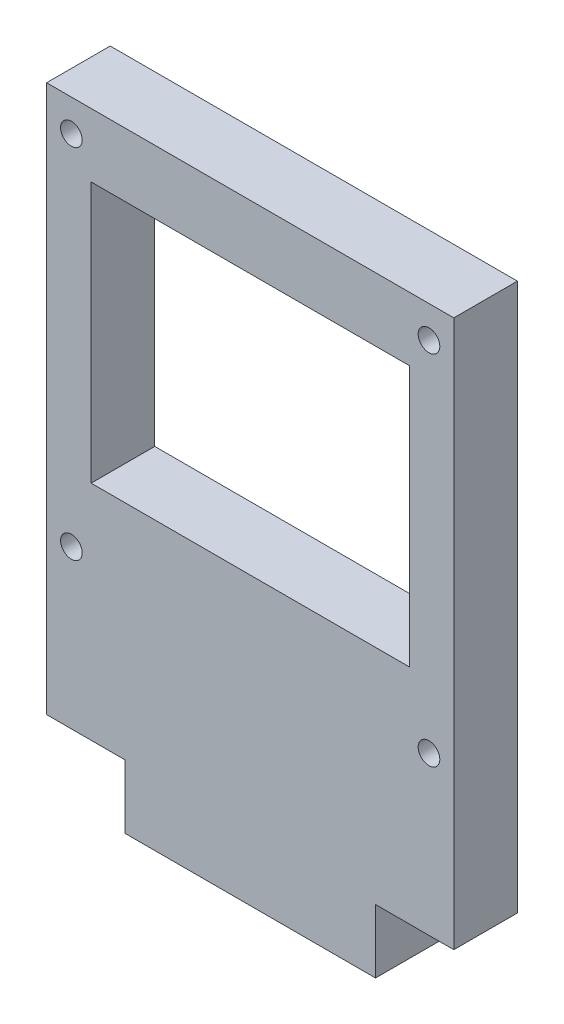
ISO-10303-21;
HEADER;
FILE_DESCRIPTION(('STEP AP214'),'2;1');
FILE_NAME('part.step','',(''),(''),'','','');
FILE_SCHEMA(('AUTOMOTIVE_DESIGN { 1 0 10303 214 1 1 1 1 }'));
ENDSEC;
DATA;
#1=APPLICATION_CONTEXT('core data for automotive mechanical design processes');
#2=APPLICATION_PROTOCOL_DEFINITION('international standard','automotive_design',2000,#1);
#3=PRODUCT_CONTEXT('',#1,'mechanical');
#4=PRODUCT('Part','Part','',(#3));
#5=PRODUCT_RELATED_PRODUCT_CATEGORY('part','',(#4));
#6=PRODUCT_DEFINITION_FORMATION('','',#4);
#7=PRODUCT_DEFINITION_CONTEXT('part definition',#1,'design');
#8=PRODUCT_DEFINITION('design','',#6,#7);
#9=PRODUCT_DEFINITION_SHAPE('','',#8);
#10=(LENGTH_UNIT() NAMED_UNIT(*) SI_UNIT(.MILLI.,.METRE.));
#11=(NAMED_UNIT(*) PLANE_ANGLE_UNIT() SI_UNIT($,.RADIAN.));
#12=(NAMED_UNIT(*) SI_UNIT($,.STERADIAN.) SOLID_ANGLE_UNIT());
#13=UNCERTAINTY_MEASURE_WITH_UNIT(LENGTH_MEASURE(1.E-05),#10,'distance_accuracy_value','');
#14=(GEOMETRIC_REPRESENTATION_CONTEXT(3) GLOBAL_UNCERTAINTY_ASSIGNED_CONTEXT((#13)) GLOBAL_UNIT_ASSIGNED_CONTEXT((#10,
#11,#12)) REPRESENTATION_CONTEXT('',''));
#15=CARTESIAN_POINT('',(0.,0.,0.));
#16=DIRECTION('',(0.,0.,1.));
#17=DIRECTION('',(1.,0.,0.));
#18=AXIS2_PLACEMENT_3D('',#15,#16,#17);
#19=CARTESIAN_POINT('',(-9.85,5.,-5.));
#20=DIRECTION('',(1.,0.,0.));
#21=DIRECTION('',(0.,0.,-1.));
#22=AXIS2_PLACEMENT_3D('',#19,#20,#21);
#23=PLANE('',#22);
#24=DIRECTION('',(0.,0.,1.));
#25=VECTOR('',#24,1.);
#26=CARTESIAN_POINT('',(-9.85,0.,-5.));
#27=LINE('',#26,#25);
#28=CARTESIAN_POINT('',(-9.85,0.,-5.));
#29=VERTEX_POINT('',#28);
#30=CARTESIAN_POINT('',(-9.85,0.,0.));
#31=VERTEX_POINT('',#30);
#32=EDGE_CURVE('E216',#29,#31,#27,.T.);
#33=ORIENTED_EDGE('',*,*,#32,.T.);
#34=DIRECTION('',(0.,-1.,0.));
#35=VECTOR('',#34,1.);
#36=CARTESIAN_POINT('',(-9.85,5.,0.));
#37=LINE('',#36,#35);
#38=CARTESIAN_POINT('',(-9.85,5.,0.));
#39=VERTEX_POINT('',#38);
#40=EDGE_CURVE('E11',#39,#31,#37,.T.);
#41=ORIENTED_EDGE('',*,*,#40,.F.);
#42=DIRECTION('',(0.,0.,1.));
#43=VECTOR('',#42,1.);
#44=CARTESIAN_POINT('',(-9.85,5.,-5.));
#45=LINE('',#44,#43);
#46=CARTESIAN_POINT('',(-9.85,5.,-5.));
#47=VERTEX_POINT('',#46);
#48=EDGE_CURVE('E209',#47,#39,#45,.T.);
#49=ORIENTED_EDGE('',*,*,#48,.F.);
#50=DIRECTION('',(0.,-1.,0.));
#51=VECTOR('',#50,1.);
#52=CARTESIAN_POINT('',(-9.85,5.,-5.));
#53=LINE('',#52,#51);
#54=EDGE_CURVE('E56',#47,#29,#53,.T.);
#55=ORIENTED_EDGE('',*,*,#54,.T.);
#56=EDGE_LOOP('',(#33,#41,#49,#55));
#57=FACE_BOUND('',#56,.T.);
#58=ADVANCED_FACE('F39',(#57),#23,.F.);
#59=CARTESIAN_POINT('',(-9.85,5.,0.));
#60=DIRECTION('',(0.,0.,-1.));
#61=DIRECTION('',(-1.,0.,0.));
#62=AXIS2_PLACEMENT_3D('',#59,#60,#61);
#63=PLANE('',#62);
#64=CARTESIAN_POINT('',(14.05,45.5,0.));
#65=DIRECTION('',(0.,0.,1.));
#66=DIRECTION('',(-1.,0.,0.));
#67=AXIS2_PLACEMENT_3D('',#64,#65,#66);
#68=CIRCLE('',#67,0.850000000000001);
#69=CARTESIAN_POINT('',(14.9,45.5,0.));
#70=VERTEX_POINT('',#69);
#71=EDGE_CURVE('E411',#70,#70,#68,.T.);
#72=ORIENTED_EDGE('',*,*,#71,.F.);
#73=EDGE_LOOP('',(#72));
#74=FACE_BOUND('',#73,.T.);
#75=CARTESIAN_POINT('',(14.05,17.4,0.));
#76=DIRECTION('',(0.,0.,1.));
#77=DIRECTION('',(-1.,0.,0.));
#78=AXIS2_PLACEMENT_3D('',#75,#76,#77);
#79=CIRCLE('',#78,0.85);
#80=CARTESIAN_POINT('',(14.9,17.4,0.));
#81=VERTEX_POINT('',#80);
#82=EDGE_CURVE('E415',#81,#81,#79,.T.);
#83=ORIENTED_EDGE('',*,*,#82,.F.);
#84=EDGE_LOOP('',(#83));
#85=FACE_BOUND('',#84,.T.);
#86=CARTESIAN_POINT('',(-14.05,17.4,0.));
#87=DIRECTION('',(0.,0.,1.));
#88=DIRECTION('',(1.,0.,0.));
#89=AXIS2_PLACEMENT_3D('',#86,#87,#88);
#90=CIRCLE('',#89,0.85);
#91=CARTESIAN_POINT('',(-13.2,17.4,0.));
#92=VERTEX_POINT('',#91);
#93=EDGE_CURVE('E421',#92,#92,#90,.T.);
#94=ORIENTED_EDGE('',*,*,#93,.F.);
#95=EDGE_LOOP('',(#94));
#96=FACE_BOUND('',#95,.T.);
#97=CARTESIAN_POINT('',(-14.05,45.5,0.));
#98=DIRECTION('',(0.,0.,1.));
#99=DIRECTION('',(1.,0.,0.));
#100=AXIS2_PLACEMENT_3D('',#97,#98,#99);
#101=CIRCLE('',#100,0.850000000000001);
#102=CARTESIAN_POINT('',(-13.2,45.5,0.));
#103=VERTEX_POINT('',#102);
#104=EDGE_CURVE('E269',#103,#103,#101,.T.);
#105=ORIENTED_EDGE('',*,*,#104,.F.);
#106=EDGE_LOOP('',(#105));
#107=FACE_BOUND('',#106,.T.);
#108=DIRECTION('',(1.,0.,0.));
#109=VECTOR('',#108,1.);
#110=CARTESIAN_POINT('',(-9.85,0.,0.));
#111=LINE('',#110,#109);
#112=CARTESIAN_POINT('',(9.85,0.,0.));
#113=VERTEX_POINT('',#112);
#114=EDGE_CURVE('E219',#31,#113,#111,.T.);
#115=ORIENTED_EDGE('',*,*,#114,.T.);
#116=DIRECTION('',(0.,-1.,0.));
#117=VECTOR('',#116,1.);
#118=CARTESIAN_POINT('',(9.85,5.,0.));
#119=LINE('',#118,#117);
#120=CARTESIAN_POINT('',(9.85,5.,0.));
#121=VERTEX_POINT('',#120);
#122=EDGE_CURVE('E48',#121,#113,#119,.T.);
#123=ORIENTED_EDGE('',*,*,#122,.F.);
#124=DIRECTION('',(1.,0.,0.));
#125=VECTOR('',#124,1.);
#126=CARTESIAN_POINT('',(-16.,5.,0.));
#127=LINE('',#126,#125);
#128=CARTESIAN_POINT('',(16.,5.,0.));
#129=VERTEX_POINT('',#128);
#130=EDGE_CURVE('E179',#121,#129,#127,.T.);
#131=ORIENTED_EDGE('',*,*,#130,.T.);
#132=DIRECTION('',(0.,1.,0.));
#133=VECTOR('',#132,1.);
#134=CARTESIAN_POINT('',(16.,5.,0.));
#135=LINE('',#134,#133);
#136=CARTESIAN_POINT('',(16.,48.,0.));
#137=VERTEX_POINT('',#136);
#138=EDGE_CURVE('E184',#129,#137,#135,.T.);
#139=ORIENTED_EDGE('',*,*,#138,.T.);
#140=DIRECTION('',(-1.,0.,0.));
#141=VECTOR('',#140,1.);
#142=CARTESIAN_POINT('',(-16.,48.,0.));
#143=LINE('',#142,#141);
#144=CARTESIAN_POINT('',(-16.,48.,0.));
#145=VERTEX_POINT('',#144);
#146=EDGE_CURVE('E188',#137,#145,#143,.T.);
#147=ORIENTED_EDGE('',*,*,#146,.T.);
#148=DIRECTION('',(0.,-1.,0.));
#149=VECTOR('',#148,1.);
#150=CARTESIAN_POINT('',(-16.,5.,0.));
#151=LINE('',#150,#149);
#152=CARTESIAN_POINT('',(-16.,5.,0.));
#153=VERTEX_POINT('',#152);
#154=EDGE_CURVE('E171',#145,#153,#151,.T.);
#155=ORIENTED_EDGE('',*,*,#154,.T.);
#156=EDGE_CURVE('E180',#153,#39,#127,.T.);
#157=ORIENTED_EDGE('',*,*,#156,.T.);
#158=ORIENTED_EDGE('',*,*,#40,.T.);
#159=EDGE_LOOP('',(#115,#123,#131,#139,#147,#155,#157,#158));
#160=FACE_BOUND('',#159,.T.);
#161=DIRECTION('',(1.,0.,0.));
#162=VECTOR('',#161,1.);
#163=CARTESIAN_POINT('',(-12.5,22.5,0.));
#164=LINE('',#163,#162);
#165=CARTESIAN_POINT('',(-12.5,22.5,0.));
#166=VERTEX_POINT('',#165);
#167=CARTESIAN_POINT('',(12.5,22.5,0.));
#168=VERTEX_POINT('',#167);
#169=EDGE_CURVE('E150',#166,#168,#164,.T.);
#170=ORIENTED_EDGE('',*,*,#169,.F.);
#171=DIRECTION('',(0.,-1.,0.));
#172=VECTOR('',#171,1.);
#173=CARTESIAN_POINT('',(-12.5,22.5,0.));
#174=LINE('',#173,#172);
#175=CARTESIAN_POINT('',(-12.5,43.,0.));
#176=VERTEX_POINT('',#175);
#177=EDGE_CURVE('E157',#176,#166,#174,.T.);
#178=ORIENTED_EDGE('',*,*,#177,.F.);
#179=DIRECTION('',(-1.,0.,0.));
#180=VECTOR('',#179,1.);
#181=CARTESIAN_POINT('',(-12.5,43.,0.));
#182=LINE('',#181,#180);
#183=CARTESIAN_POINT('',(12.5,43.,0.));
#184=VERTEX_POINT('',#183);
#185=EDGE_CURVE('E161',#184,#176,#182,.T.);
#186=ORIENTED_EDGE('',*,*,#185,.F.);
#187=DIRECTION('',(0.,1.,0.));
#188=VECTOR('',#187,1.);
#189=CARTESIAN_POINT('',(12.5,22.5,0.));
#190=LINE('',#189,#188);
#191=EDGE_CURVE('E140',#168,#184,#190,.T.);
#192=ORIENTED_EDGE('',*,*,#191,.F.);
#193=EDGE_LOOP('',(#170,#178,#186,#192));
#194=FACE_BOUND('',#193,.T.);
#195=ADVANCED_FACE('F159',(#74,#85,#96,#107,#160,#194),#63,.F.);
#196=CARTESIAN_POINT('',(9.85,5.,-5.));
#197=DIRECTION('',(-1.,0.,0.));
#198=DIRECTION('',(0.,0.,1.));
#199=AXIS2_PLACEMENT_3D('',#196,#197,#198);
#200=PLANE('',#199);
#201=DIRECTION('',(0.,0.,-1.));
#202=VECTOR('',#201,1.);
#203=CARTESIAN_POINT('',(9.85,0.,-5.));
#204=LINE('',#203,#202);
#205=CARTESIAN_POINT('',(9.85,0.,-5.));
#206=VERTEX_POINT('',#205);
#207=EDGE_CURVE('E75',#113,#206,#204,.T.);
#208=ORIENTED_EDGE('',*,*,#207,.T.);
#209=DIRECTION('',(0.,-1.,0.));
#210=VECTOR('',#209,1.);
#211=CARTESIAN_POINT('',(9.85,5.,-5.));
#212=LINE('',#211,#210);
#213=CARTESIAN_POINT('',(9.85,5.,-5.));
#214=VERTEX_POINT('',#213);
#215=EDGE_CURVE('E229',#214,#206,#212,.T.);
#216=ORIENTED_EDGE('',*,*,#215,.F.);
#217=DIRECTION('',(0.,0.,-1.));
#218=VECTOR('',#217,1.);
#219=CARTESIAN_POINT('',(9.85,5.,-5.));
#220=LINE('',#219,#218);
#221=EDGE_CURVE('E212',#121,#214,#220,.T.);
#222=ORIENTED_EDGE('',*,*,#221,.F.);
#223=ORIENTED_EDGE('',*,*,#122,.T.);
#224=EDGE_LOOP('',(#208,#216,#222,#223));
#225=FACE_BOUND('',#224,.T.);
#226=ADVANCED_FACE('F233',(#225),#200,.F.);
#227=CARTESIAN_POINT('',(-9.85,5.,-5.));
#228=DIRECTION('',(0.,0.,1.));
#229=DIRECTION('',(1.,0.,0.));
#230=AXIS2_PLACEMENT_3D('',#227,#228,#229);
#231=PLANE('',#230);
#232=CARTESIAN_POINT('',(14.05,45.5,-5.));
#233=DIRECTION('',(0.,0.,1.));
#234=DIRECTION('',(1.,0.,0.));
#235=AXIS2_PLACEMENT_3D('',#232,#233,#234);
#236=CIRCLE('',#235,0.850000000000001);
#237=CARTESIAN_POINT('',(14.9,45.5,-5.));
#238=VERTEX_POINT('',#237);
#239=EDGE_CURVE('E409',#238,#238,#236,.F.);
#240=ORIENTED_EDGE('',*,*,#239,.F.);
#241=EDGE_LOOP('',(#240));
#242=FACE_BOUND('',#241,.T.);
#243=CARTESIAN_POINT('',(14.05,17.4,-5.));
#244=DIRECTION('',(0.,0.,1.));
#245=DIRECTION('',(1.,0.,0.));
#246=AXIS2_PLACEMENT_3D('',#243,#244,#245);
#247=CIRCLE('',#246,0.85);
#248=CARTESIAN_POINT('',(14.9,17.4,-5.));
#249=VERTEX_POINT('',#248);
#250=EDGE_CURVE('E417',#249,#249,#247,.F.);
#251=ORIENTED_EDGE('',*,*,#250,.F.);
#252=EDGE_LOOP('',(#251));
#253=FACE_BOUND('',#252,.T.);
#254=CARTESIAN_POINT('',(-14.05,17.4,-5.));
#255=DIRECTION('',(0.,0.,1.));
#256=DIRECTION('',(1.,0.,0.));
#257=AXIS2_PLACEMENT_3D('',#254,#255,#256);
#258=CIRCLE('',#257,0.85);
#259=CARTESIAN_POINT('',(-13.2,17.4,-5.));
#260=VERTEX_POINT('',#259);
#261=EDGE_CURVE('E275',#260,#260,#258,.F.);
#262=ORIENTED_EDGE('',*,*,#261,.F.);
#263=EDGE_LOOP('',(#262));
#264=FACE_BOUND('',#263,.T.);
#265=CARTESIAN_POINT('',(-14.05,45.5,-5.));
#266=DIRECTION('',(0.,0.,1.));
#267=DIRECTION('',(1.,0.,0.));
#268=AXIS2_PLACEMENT_3D('',#265,#266,#267);
#269=CIRCLE('',#268,0.850000000000001);
#270=CARTESIAN_POINT('',(-13.2,45.5,-5.));
#271=VERTEX_POINT('',#270);
#272=EDGE_CURVE('E265',#271,#271,#269,.F.);
#273=ORIENTED_EDGE('',*,*,#272,.F.);
#274=EDGE_LOOP('',(#273));
#275=FACE_BOUND('',#274,.T.);
#276=DIRECTION('',(-1.,0.,0.));
#277=VECTOR('',#276,1.);
#278=CARTESIAN_POINT('',(-9.85,0.,-5.));
#279=LINE('',#278,#277);
#280=EDGE_CURVE('E78',#206,#29,#279,.T.);
#281=ORIENTED_EDGE('',*,*,#280,.T.);
#282=ORIENTED_EDGE('',*,*,#54,.F.);
#283=DIRECTION('',(-1.,0.,0.));
#284=VECTOR('',#283,1.);
#285=CARTESIAN_POINT('',(-16.,5.,-5.));
#286=LINE('',#285,#284);
#287=CARTESIAN_POINT('',(-16.,5.,-5.));
#288=VERTEX_POINT('',#287);
#289=EDGE_CURVE('E243',#47,#288,#286,.T.);
#290=ORIENTED_EDGE('',*,*,#289,.T.);
#291=DIRECTION('',(0.,1.,0.));
#292=VECTOR('',#291,1.);
#293=CARTESIAN_POINT('',(-16.,5.,-5.));
#294=LINE('',#293,#292);
#295=CARTESIAN_POINT('',(-16.,48.,-5.));
#296=VERTEX_POINT('',#295);
#297=EDGE_CURVE('E262',#288,#296,#294,.T.);
#298=ORIENTED_EDGE('',*,*,#297,.T.);
#299=DIRECTION('',(1.,0.,0.));
#300=VECTOR('',#299,1.);
#301=CARTESIAN_POINT('',(-16.,48.,-5.));
#302=LINE('',#301,#300);
#303=CARTESIAN_POINT('',(16.,48.,-5.));
#304=VERTEX_POINT('',#303);
#305=EDGE_CURVE('E259',#296,#304,#302,.T.);
#306=ORIENTED_EDGE('',*,*,#305,.T.);
#307=DIRECTION('',(0.,-1.,0.));
#308=VECTOR('',#307,1.);
#309=CARTESIAN_POINT('',(16.,5.,-5.));
#310=LINE('',#309,#308);
#311=CARTESIAN_POINT('',(16.,5.,-5.00000000000001));
#312=VERTEX_POINT('',#311);
#313=EDGE_CURVE('E208',#304,#312,#310,.T.);
#314=ORIENTED_EDGE('',*,*,#313,.T.);
#315=EDGE_CURVE('E220',#312,#214,#286,.T.);
#316=ORIENTED_EDGE('',*,*,#315,.T.);
#317=ORIENTED_EDGE('',*,*,#215,.T.);
#318=EDGE_LOOP('',(#281,#282,#290,#298,#306,#314,#316,#317));
#319=FACE_BOUND('',#318,.T.);
#320=DIRECTION('',(-1.,0.,0.));
#321=VECTOR('',#320,1.);
#322=CARTESIAN_POINT('',(-12.5,22.5,-5.));
#323=LINE('',#322,#321);
#324=CARTESIAN_POINT('',(12.5,22.5,-5.));
#325=VERTEX_POINT('',#324);
#326=CARTESIAN_POINT('',(-12.5,22.5,-5.00000000000001));
#327=VERTEX_POINT('',#326);
#328=EDGE_CURVE('E196',#325,#327,#323,.T.);
#329=ORIENTED_EDGE('',*,*,#328,.F.);
#330=DIRECTION('',(0.,-1.,0.));
#331=VECTOR('',#330,1.);
#332=CARTESIAN_POINT('',(12.5,22.5,-5.));
#333=LINE('',#332,#331);
#334=CARTESIAN_POINT('',(12.5,43.,-5.));
#335=VERTEX_POINT('',#334);
#336=EDGE_CURVE('E142',#335,#325,#333,.T.);
#337=ORIENTED_EDGE('',*,*,#336,.F.);
#338=DIRECTION('',(1.,0.,0.));
#339=VECTOR('',#338,1.);
#340=CARTESIAN_POINT('',(-12.5,43.,-5.));
#341=LINE('',#340,#339);
#342=CARTESIAN_POINT('',(-12.5,43.,-5.));
#343=VERTEX_POINT('',#342);
#344=EDGE_CURVE('E251',#343,#335,#341,.T.);
#345=ORIENTED_EDGE('',*,*,#344,.F.);
#346=DIRECTION('',(0.,1.,0.));
#347=VECTOR('',#346,1.);
#348=CARTESIAN_POINT('',(-12.5,22.5,-5.));
#349=LINE('',#348,#347);
#350=EDGE_CURVE('E255',#327,#343,#349,.T.);
#351=ORIENTED_EDGE('',*,*,#350,.F.);
#352=EDGE_LOOP('',(#329,#337,#345,#351));
#353=FACE_BOUND('',#352,.T.);
#354=ADVANCED_FACE('F286',(#242,#253,#264,#275,#319,#353),#231,.F.);
#355=CARTESIAN_POINT('',(0.,0.,0.));
#356=DIRECTION('',(0.,1.,0.));
#357=DIRECTION('',(0.,0.,1.));
#358=AXIS2_PLACEMENT_3D('',#355,#356,#357);
#359=PLANE('',#358);
#360=ORIENTED_EDGE('',*,*,#32,.F.);
#361=ORIENTED_EDGE('',*,*,#280,.F.);
#362=ORIENTED_EDGE('',*,*,#207,.F.);
#363=ORIENTED_EDGE('',*,*,#114,.F.);
#364=EDGE_LOOP('',(#360,#361,#362,#363));
#365=FACE_BOUND('',#364,.T.);
#366=ADVANCED_FACE('F238',(#365),#359,.F.);
#367=CARTESIAN_POINT('',(-16.,5.,-58.6003731330296));
#368=DIRECTION('',(0.,-1.,0.));
#369=DIRECTION('',(0.,0.,-1.));
#370=AXIS2_PLACEMENT_3D('',#367,#368,#369);
#371=PLANE('',#370);
#372=ORIENTED_EDGE('',*,*,#289,.F.);
#373=ORIENTED_EDGE('',*,*,#48,.T.);
#374=ORIENTED_EDGE('',*,*,#156,.F.);
#375=DIRECTION('',(0.,0.,1.));
#376=VECTOR('',#375,1.);
#377=CARTESIAN_POINT('',(-16.,5.,-58.6003731330296));
#378=LINE('',#377,#376);
#379=EDGE_CURVE('E192',#288,#153,#378,.T.);
#380=ORIENTED_EDGE('',*,*,#379,.F.);
#381=EDGE_LOOP('',(#372,#373,#374,#380));
#382=FACE_BOUND('',#381,.T.);
#383=ADVANCED_FACE('F244',(#382),#371,.T.);
#384=ORIENTED_EDGE('',*,*,#130,.F.);
#385=ORIENTED_EDGE('',*,*,#221,.T.);
#386=ORIENTED_EDGE('',*,*,#315,.F.);
#387=DIRECTION('',(0.,0.,1.));
#388=VECTOR('',#387,1.);
#389=CARTESIAN_POINT('',(16.,5.,-58.6003731330296));
#390=LINE('',#389,#388);
#391=EDGE_CURVE('E200',#312,#129,#390,.T.);
#392=ORIENTED_EDGE('',*,*,#391,.T.);
#393=EDGE_LOOP('',(#384,#385,#386,#392));
#394=FACE_BOUND('',#393,.T.);
#395=ADVANCED_FACE('F320',(#394),#371,.T.);
#396=CARTESIAN_POINT('',(16.,5.,-58.6003731330296));
#397=DIRECTION('',(1.,0.,0.));
#398=DIRECTION('',(0.,0.,-1.));
#399=AXIS2_PLACEMENT_3D('',#396,#397,#398);
#400=PLANE('',#399);
#401=ORIENTED_EDGE('',*,*,#313,.F.);
#402=DIRECTION('',(0.,0.,1.));
#403=VECTOR('',#402,1.);
#404=CARTESIAN_POINT('',(16.,48.,-58.6003731330296));
#405=LINE('',#404,#403);
#406=EDGE_CURVE('E197',#304,#137,#405,.T.);
#407=ORIENTED_EDGE('',*,*,#406,.T.);
#408=ORIENTED_EDGE('',*,*,#138,.F.);
#409=ORIENTED_EDGE('',*,*,#391,.F.);
#410=EDGE_LOOP('',(#401,#407,#408,#409));
#411=FACE_BOUND('',#410,.T.);
#412=ADVANCED_FACE('F323',(#411),#400,.T.);
#413=CARTESIAN_POINT('',(-16.,48.,-58.6003731330296));
#414=DIRECTION('',(0.,1.,0.));
#415=DIRECTION('',(0.,0.,1.));
#416=AXIS2_PLACEMENT_3D('',#413,#414,#415);
#417=PLANE('',#416);
#418=ORIENTED_EDGE('',*,*,#305,.F.);
#419=DIRECTION('',(0.,0.,1.));
#420=VECTOR('',#419,1.);
#421=CARTESIAN_POINT('',(-16.,48.,-58.6003731330296));
#422=LINE('',#421,#420);
#423=EDGE_CURVE('E193',#296,#145,#422,.T.);
#424=ORIENTED_EDGE('',*,*,#423,.T.);
#425=ORIENTED_EDGE('',*,*,#146,.F.);
#426=ORIENTED_EDGE('',*,*,#406,.F.);
#427=EDGE_LOOP('',(#418,#424,#425,#426));
#428=FACE_BOUND('',#427,.T.);
#429=ADVANCED_FACE('F318',(#428),#417,.T.);
#430=CARTESIAN_POINT('',(-16.,5.,-58.6003731330296));
#431=DIRECTION('',(-1.,0.,0.));
#432=DIRECTION('',(0.,0.,1.));
#433=AXIS2_PLACEMENT_3D('',#430,#431,#432);
#434=PLANE('',#433);
#435=ORIENTED_EDGE('',*,*,#297,.F.);
#436=ORIENTED_EDGE('',*,*,#379,.T.);
#437=ORIENTED_EDGE('',*,*,#154,.F.);
#438=ORIENTED_EDGE('',*,*,#423,.F.);
#439=EDGE_LOOP('',(#435,#436,#437,#438));
#440=FACE_BOUND('',#439,.T.);
#441=ADVANCED_FACE('F315',(#440),#434,.T.);
#442=CARTESIAN_POINT('',(-12.5,22.5,-58.6003731330296));
#443=DIRECTION('',(0.,-1.,0.));
#444=DIRECTION('',(0.,0.,-1.));
#445=AXIS2_PLACEMENT_3D('',#442,#443,#444);
#446=PLANE('',#445);
#447=DIRECTION('',(0.,0.,1.));
#448=VECTOR('',#447,1.);
#449=CARTESIAN_POINT('',(12.5,22.5,-58.6003731330296));
#450=LINE('',#449,#448);
#451=EDGE_CURVE('E135',#325,#168,#450,.T.);
#452=ORIENTED_EDGE('',*,*,#451,.F.);
#453=ORIENTED_EDGE('',*,*,#328,.T.);
#454=DIRECTION('',(0.,0.,1.));
#455=VECTOR('',#454,1.);
#456=CARTESIAN_POINT('',(-12.5,22.5,-58.6003731330296));
#457=LINE('',#456,#455);
#458=EDGE_CURVE('E147',#327,#166,#457,.T.);
#459=ORIENTED_EDGE('',*,*,#458,.T.);
#460=ORIENTED_EDGE('',*,*,#169,.T.);
#461=EDGE_LOOP('',(#452,#453,#459,#460));
#462=FACE_BOUND('',#461,.T.);
#463=ADVANCED_FACE('F151',(#462),#446,.F.);
#464=CARTESIAN_POINT('',(12.5,22.5,-58.6003731330296));
#465=DIRECTION('',(1.,0.,0.));
#466=DIRECTION('',(0.,0.,-1.));
#467=AXIS2_PLACEMENT_3D('',#464,#465,#466);
#468=PLANE('',#467);
#469=DIRECTION('',(0.,0.,1.));
#470=VECTOR('',#469,1.);
#471=CARTESIAN_POINT('',(12.5,43.,-58.6003731330296));
#472=LINE('',#471,#470);
#473=EDGE_CURVE('E146',#335,#184,#472,.T.);
#474=ORIENTED_EDGE('',*,*,#473,.F.);
#475=ORIENTED_EDGE('',*,*,#336,.T.);
#476=ORIENTED_EDGE('',*,*,#451,.T.);
#477=ORIENTED_EDGE('',*,*,#191,.T.);
#478=EDGE_LOOP('',(#474,#475,#476,#477));
#479=FACE_BOUND('',#478,.T.);
#480=ADVANCED_FACE('F138',(#479),#468,.F.);
#481=CARTESIAN_POINT('',(-12.5,43.,-58.6003731330296));
#482=DIRECTION('',(0.,1.,0.));
#483=DIRECTION('',(0.,0.,1.));
#484=AXIS2_PLACEMENT_3D('',#481,#482,#483);
#485=PLANE('',#484);
#486=DIRECTION('',(0.,0.,1.));
#487=VECTOR('',#486,1.);
#488=CARTESIAN_POINT('',(-12.5,43.,-58.6003731330296));
#489=LINE('',#488,#487);
#490=EDGE_CURVE('E168',#343,#176,#489,.T.);
#491=ORIENTED_EDGE('',*,*,#490,.F.);
#492=ORIENTED_EDGE('',*,*,#344,.T.);
#493=ORIENTED_EDGE('',*,*,#473,.T.);
#494=ORIENTED_EDGE('',*,*,#185,.T.);
#495=EDGE_LOOP('',(#491,#492,#493,#494));
#496=FACE_BOUND('',#495,.T.);
#497=ADVANCED_FACE('F287',(#496),#485,.F.);
#498=CARTESIAN_POINT('',(-12.5,22.5,-58.6003731330296));
#499=DIRECTION('',(-1.,0.,0.));
#500=DIRECTION('',(0.,0.,1.));
#501=AXIS2_PLACEMENT_3D('',#498,#499,#500);
#502=PLANE('',#501);
#503=ORIENTED_EDGE('',*,*,#458,.F.);
#504=ORIENTED_EDGE('',*,*,#350,.T.);
#505=ORIENTED_EDGE('',*,*,#490,.T.);
#506=ORIENTED_EDGE('',*,*,#177,.T.);
#507=EDGE_LOOP('',(#503,#504,#505,#506));
#508=FACE_BOUND('',#507,.T.);
#509=ADVANCED_FACE('F284',(#508),#502,.F.);
#510=CARTESIAN_POINT('',(-14.05,45.5,-7.40416305603427));
#511=DIRECTION('',(0.,0.,1.));
#512=DIRECTION('',(1.,0.,0.));
#513=AXIS2_PLACEMENT_3D('',#510,#511,#512);
#514=CYLINDRICAL_SURFACE('',#513,0.850000000000001);
#515=CARTESIAN_POINT('',(-13.2,45.5,-5.));
#516=CARTESIAN_POINT('',(-13.2,45.5,-4.94791666666667));
#517=CARTESIAN_POINT('',(-13.2,45.5,-4.89583333333333));
#518=CARTESIAN_POINT('',(-13.2,45.5,-4.79166666666667));
#519=CARTESIAN_POINT('',(-13.2,45.5,-4.73958333333333));
#520=CARTESIAN_POINT('',(-13.2,45.5,-4.63541666666667));
#521=CARTESIAN_POINT('',(-13.2,45.5,-4.58333333333333));
#522=CARTESIAN_POINT('',(-13.2,45.5,-4.47916666666667));
#523=CARTESIAN_POINT('',(-13.2,45.5,-4.42708333333333));
#524=CARTESIAN_POINT('',(-13.2,45.5,-4.32291666666667));
#525=CARTESIAN_POINT('',(-13.2,45.5,-4.27083333333333));
#526=CARTESIAN_POINT('',(-13.2,45.5,-4.16666666666667));
#527=CARTESIAN_POINT('',(-13.2,45.5,-4.11458333333333));
#528=CARTESIAN_POINT('',(-13.2,45.5,-4.01041666666667));
#529=CARTESIAN_POINT('',(-13.2,45.5,-3.95833333333333));
#530=CARTESIAN_POINT('',(-13.2,45.5,-3.85416666666667));
#531=CARTESIAN_POINT('',(-13.2,45.5,-3.80208333333333));
#532=CARTESIAN_POINT('',(-13.2,45.5,-3.69791666666667));
#533=CARTESIAN_POINT('',(-13.2,45.5,-3.64583333333333));
#534=CARTESIAN_POINT('',(-13.2,45.5,-3.54166666666667));
#535=CARTESIAN_POINT('',(-13.2,45.5,-3.48958333333333));
#536=CARTESIAN_POINT('',(-13.2,45.5,-3.38541666666667));
#537=CARTESIAN_POINT('',(-13.2,45.5,-3.33333333333333));
#538=CARTESIAN_POINT('',(-13.2,45.5,-3.22916666666667));
#539=CARTESIAN_POINT('',(-13.2,45.5,-3.17708333333333));
#540=CARTESIAN_POINT('',(-13.2,45.5,-3.07291666666667));
#541=CARTESIAN_POINT('',(-13.2,45.5,-3.02083333333333));
#542=CARTESIAN_POINT('',(-13.2,45.5,-2.91666666666667));
#543=CARTESIAN_POINT('',(-13.2,45.5,-2.86458333333333));
#544=CARTESIAN_POINT('',(-13.2,45.5,-2.76041666666667));
#545=CARTESIAN_POINT('',(-13.2,45.5,-2.70833333333333));
#546=CARTESIAN_POINT('',(-13.2,45.5,-2.60416666666667));
#547=CARTESIAN_POINT('',(-13.2,45.5,-2.55208333333333));
#548=CARTESIAN_POINT('',(-13.2,45.5,-2.44791666666667));
#549=CARTESIAN_POINT('',(-13.2,45.5,-2.39583333333333));
#550=CARTESIAN_POINT('',(-13.2,45.5,-2.29166666666667));
#551=CARTESIAN_POINT('',(-13.2,45.5,-2.23958333333333));
#552=CARTESIAN_POINT('',(-13.2,45.5,-2.13541666666667));
#553=CARTESIAN_POINT('',(-13.2,45.5,-2.08333333333333));
#554=CARTESIAN_POINT('',(-13.2,45.5,-1.97916666666667));
#555=CARTESIAN_POINT('',(-13.2,45.5,-1.92708333333333));
#556=CARTESIAN_POINT('',(-13.2,45.5,-1.82291666666667));
#557=CARTESIAN_POINT('',(-13.2,45.5,-1.77083333333333));
#558=CARTESIAN_POINT('',(-13.2,45.5,-1.66666666666667));
#559=CARTESIAN_POINT('',(-13.2,45.5,-1.61458333333333));
#560=CARTESIAN_POINT('',(-13.2,45.5,-1.51041666666667));
#561=CARTESIAN_POINT('',(-13.2,45.5,-1.45833333333333));
#562=CARTESIAN_POINT('',(-13.2,45.5,-1.35416666666667));
#563=CARTESIAN_POINT('',(-13.2,45.5,-1.30208333333333));
#564=CARTESIAN_POINT('',(-13.2,45.5,-1.19791666666667));
#565=CARTESIAN_POINT('',(-13.2,45.5,-1.14583333333333));
#566=CARTESIAN_POINT('',(-13.2,45.5,-1.04166666666667));
#567=CARTESIAN_POINT('',(-13.2,45.5,-0.989583333333334));
#568=CARTESIAN_POINT('',(-13.2,45.5,-0.885416666666668));
#569=CARTESIAN_POINT('',(-13.2,45.5,-0.833333333333334));
#570=CARTESIAN_POINT('',(-13.2,45.5,-0.729166666666667));
#571=CARTESIAN_POINT('',(-13.2,45.5,-0.677083333333334));
#572=CARTESIAN_POINT('',(-13.2,45.5,-0.572916666666667));
#573=CARTESIAN_POINT('',(-13.2,45.5,-0.520833333333334));
#574=CARTESIAN_POINT('',(-13.2,45.5,-0.416666666666667));
#575=CARTESIAN_POINT('',(-13.2,45.5,-0.364583333333334));
#576=CARTESIAN_POINT('',(-13.2,45.5,-0.260416666666668));
#577=CARTESIAN_POINT('',(-13.2,45.5,-0.208333333333334));
#578=CARTESIAN_POINT('',(-13.2,45.5,-0.104166666666668));
#579=CARTESIAN_POINT('',(-13.2,45.5,-0.0520833333333343));
#580=CARTESIAN_POINT('',(-13.2,45.5,0.));
#581=B_SPLINE_CURVE_WITH_KNOTS('',3,(#515,#516,#517,#518,#519,#520,#521,#522,#523,#524,#525,
#526,#527,#528,#529,#530,#531,#532,#533,#534,#535,#536,#537,#538,#539,#540,#541,#542,#543,#544,
#545,#546,#547,#548,#549,#550,#551,#552,#553,#554,#555,#556,#557,#558,#559,#560,#561,#562,#563,
#564,#565,#566,#567,#568,#569,#570,#571,#572,#573,#574,#575,#576,#577,#578,#579,#580),
.UNSPECIFIED.,.F.,.F.,(4,2,2,2,2,2,2,2,2,2,2,2,2,2,2,2,2,2,2,2,2,2,2,2,2,2,2,2,2,2,2,2,4),(0.,
0.15625,0.312499999999999,0.46875,0.624999999999999,0.781249999999999,0.937499999999999,1.09375,
1.25,1.40625,1.5625,1.71875,1.875,2.03125,2.1875,2.34375,2.5,2.65625,2.8125,2.96875,3.125,
3.28125,3.4375,3.59375,3.75,3.90625,4.0625,4.21875,4.375,4.53125,4.6875,4.84375,5.),.UNSPECIFIED.);
#582=EDGE_CURVE('BSEAM294',#271,#103,#581,.T.);
#583=ORIENTED_EDGE('',*,*,#272,.T.);
#584=ORIENTED_EDGE('',*,*,#104,.T.);
#585=ORIENTED_EDGE('',*,*,#582,.T.);
#586=ORIENTED_EDGE('',*,*,#582,.F.);
#587=EDGE_LOOP('',(#583,#585,#584,#586));
#588=FACE_BOUND('',#587,.T.);
#589=ADVANCED_FACE('F294',(#588),#514,.F.);
#590=CARTESIAN_POINT('',(-14.05,17.4,-7.40416305603427));
#591=DIRECTION('',(0.,0.,1.));
#592=DIRECTION('',(1.,0.,0.));
#593=AXIS2_PLACEMENT_3D('',#590,#591,#592);
#594=CYLINDRICAL_SURFACE('',#593,0.85);
#595=CARTESIAN_POINT('',(-13.2,17.4,-5.));
#596=CARTESIAN_POINT('',(-13.2,17.4,-4.94791666666667));
#597=CARTESIAN_POINT('',(-13.2,17.4,-4.89583333333333));
#598=CARTESIAN_POINT('',(-13.2,17.4,-4.79166666666667));
#599=CARTESIAN_POINT('',(-13.2,17.4,-4.73958333333333));
#600=CARTESIAN_POINT('',(-13.2,17.4,-4.63541666666667));
#601=CARTESIAN_POINT('',(-13.2,17.4,-4.58333333333333));
#602=CARTESIAN_POINT('',(-13.2,17.4,-4.47916666666667));
#603=CARTESIAN_POINT('',(-13.2,17.4,-4.42708333333333));
#604=CARTESIAN_POINT('',(-13.2,17.4,-4.32291666666667));
#605=CARTESIAN_POINT('',(-13.2,17.4,-4.27083333333333));
#606=CARTESIAN_POINT('',(-13.2,17.4,-4.16666666666667));
#607=CARTESIAN_POINT('',(-13.2,17.4,-4.11458333333333));
#608=CARTESIAN_POINT('',(-13.2,17.4,-4.01041666666667));
#609=CARTESIAN_POINT('',(-13.2,17.4,-3.95833333333333));
#610=CARTESIAN_POINT('',(-13.2,17.4,-3.85416666666667));
#611=CARTESIAN_POINT('',(-13.2,17.4,-3.80208333333333));
#612=CARTESIAN_POINT('',(-13.2,17.4,-3.69791666666667));
#613=CARTESIAN_POINT('',(-13.2,17.4,-3.64583333333333));
#614=CARTESIAN_POINT('',(-13.2,17.4,-3.54166666666667));
#615=CARTESIAN_POINT('',(-13.2,17.4,-3.48958333333333));
#616=CARTESIAN_POINT('',(-13.2,17.4,-3.38541666666667));
#617=CARTESIAN_POINT('',(-13.2,17.4,-3.33333333333333));
#618=CARTESIAN_POINT('',(-13.2,17.4,-3.22916666666667));
#619=CARTESIAN_POINT('',(-13.2,17.4,-3.17708333333333));
#620=CARTESIAN_POINT('',(-13.2,17.4,-3.07291666666667));
#621=CARTESIAN_POINT('',(-13.2,17.4,-3.02083333333333));
#622=CARTESIAN_POINT('',(-13.2,17.4,-2.91666666666667));
#623=CARTESIAN_POINT('',(-13.2,17.4,-2.86458333333333));
#624=CARTESIAN_POINT('',(-13.2,17.4,-2.76041666666667));
#625=CARTESIAN_POINT('',(-13.2,17.4,-2.70833333333333));
#626=CARTESIAN_POINT('',(-13.2,17.4,-2.60416666666667));
#627=CARTESIAN_POINT('',(-13.2,17.4,-2.55208333333333));
#628=CARTESIAN_POINT('',(-13.2,17.4,-2.44791666666667));
#629=CARTESIAN_POINT('',(-13.2,17.4,-2.39583333333333));
#630=CARTESIAN_POINT('',(-13.2,17.4,-2.29166666666667));
#631=CARTESIAN_POINT('',(-13.2,17.4,-2.23958333333333));
#632=CARTESIAN_POINT('',(-13.2,17.4,-2.13541666666667));
#633=CARTESIAN_POINT('',(-13.2,17.4,-2.08333333333333));
#634=CARTESIAN_POINT('',(-13.2,17.4,-1.97916666666667));
#635=CARTESIAN_POINT('',(-13.2,17.4,-1.92708333333333));
#636=CARTESIAN_POINT('',(-13.2,17.4,-1.82291666666667));
#637=CARTESIAN_POINT('',(-13.2,17.4,-1.77083333333333));
#638=CARTESIAN_POINT('',(-13.2,17.4,-1.66666666666667));
#639=CARTESIAN_POINT('',(-13.2,17.4,-1.61458333333333));
#640=CARTESIAN_POINT('',(-13.2,17.4,-1.51041666666667));
#641=CARTESIAN_POINT('',(-13.2,17.4,-1.45833333333333));
#642=CARTESIAN_POINT('',(-13.2,17.4,-1.35416666666667));
#643=CARTESIAN_POINT('',(-13.2,17.4,-1.30208333333333));
#644=CARTESIAN_POINT('',(-13.2,17.4,-1.19791666666667));
#645=CARTESIAN_POINT('',(-13.2,17.4,-1.14583333333333));
#646=CARTESIAN_POINT('',(-13.2,17.4,-1.04166666666667));
#647=CARTESIAN_POINT('',(-13.2,17.4,-0.989583333333334));
#648=CARTESIAN_POINT('',(-13.2,17.4,-0.885416666666668));
#649=CARTESIAN_POINT('',(-13.2,17.4,-0.833333333333334));
#650=CARTESIAN_POINT('',(-13.2,17.4,-0.729166666666667));
#651=CARTESIAN_POINT('',(-13.2,17.4,-0.677083333333334));
#652=CARTESIAN_POINT('',(-13.2,17.4,-0.572916666666667));
#653=CARTESIAN_POINT('',(-13.2,17.4,-0.520833333333334));
#654=CARTESIAN_POINT('',(-13.2,17.4,-0.416666666666667));
#655=CARTESIAN_POINT('',(-13.2,17.4,-0.364583333333334));
#656=CARTESIAN_POINT('',(-13.2,17.4,-0.260416666666668));
#657=CARTESIAN_POINT('',(-13.2,17.4,-0.208333333333334));
#658=CARTESIAN_POINT('',(-13.2,17.4,-0.104166666666668));
#659=CARTESIAN_POINT('',(-13.2,17.4,-0.0520833333333343));
#660=CARTESIAN_POINT('',(-13.2,17.4,0.));
#661=B_SPLINE_CURVE_WITH_KNOTS('',3,(#595,#596,#597,#598,#599,#600,#601,#602,#603,#604,#605,
#606,#607,#608,#609,#610,#611,#612,#613,#614,#615,#616,#617,#618,#619,#620,#621,#622,#623,#624,
#625,#626,#627,#628,#629,#630,#631,#632,#633,#634,#635,#636,#637,#638,#639,#640,#641,#642,#643,
#644,#645,#646,#647,#648,#649,#650,#651,#652,#653,#654,#655,#656,#657,#658,#659,#660),
.UNSPECIFIED.,.F.,.F.,(4,2,2,2,2,2,2,2,2,2,2,2,2,2,2,2,2,2,2,2,2,2,2,2,2,2,2,2,2,2,2,2,4),(0.,
0.15625,0.312499999999999,0.46875,0.624999999999999,0.781249999999999,0.937499999999999,1.09375,
1.25,1.40625,1.5625,1.71875,1.875,2.03125,2.1875,2.34375,2.5,2.65625,2.8125,2.96875,3.125,
3.28125,3.4375,3.59375,3.75,3.90625,4.0625,4.21875,4.375,4.53125,4.6875,4.84375,5.),.UNSPECIFIED.);
#662=EDGE_CURVE('BSEAM374',#260,#92,#661,.T.);
#663=ORIENTED_EDGE('',*,*,#261,.T.);
#664=ORIENTED_EDGE('',*,*,#93,.T.);
#665=ORIENTED_EDGE('',*,*,#662,.T.);
#666=ORIENTED_EDGE('',*,*,#662,.F.);
#667=EDGE_LOOP('',(#663,#665,#664,#666));
#668=FACE_BOUND('',#667,.T.);
#669=ADVANCED_FACE('F374',(#668),#594,.F.);
#670=CARTESIAN_POINT('',(14.05,17.4,-7.40416305603427));
#671=DIRECTION('',(0.,0.,1.));
#672=DIRECTION('',(1.,0.,0.));
#673=AXIS2_PLACEMENT_3D('',#670,#671,#672);
#674=CYLINDRICAL_SURFACE('',#673,0.85);
#675=CARTESIAN_POINT('',(14.9,17.4,-5.));
#676=CARTESIAN_POINT('',(14.9,17.4,-4.94791666666667));
#677=CARTESIAN_POINT('',(14.9,17.4,-4.89583333333334));
#678=CARTESIAN_POINT('',(14.9,17.4,-4.79166666666667));
#679=CARTESIAN_POINT('',(14.9,17.4,-4.73958333333334));
#680=CARTESIAN_POINT('',(14.9,17.4,-4.63541666666667));
#681=CARTESIAN_POINT('',(14.9,17.4,-4.58333333333334));
#682=CARTESIAN_POINT('',(14.9,17.4,-4.47916666666667));
#683=CARTESIAN_POINT('',(14.9,17.4,-4.42708333333334));
#684=CARTESIAN_POINT('',(14.9,17.4,-4.32291666666667));
#685=CARTESIAN_POINT('',(14.9,17.4,-4.27083333333334));
#686=CARTESIAN_POINT('',(14.9,17.4,-4.16666666666667));
#687=CARTESIAN_POINT('',(14.9,17.4,-4.11458333333334));
#688=CARTESIAN_POINT('',(14.9,17.4,-4.01041666666667));
#689=CARTESIAN_POINT('',(14.9,17.4,-3.95833333333334));
#690=CARTESIAN_POINT('',(14.9,17.4,-3.85416666666667));
#691=CARTESIAN_POINT('',(14.9,17.4,-3.80208333333334));
#692=CARTESIAN_POINT('',(14.9,17.4,-3.69791666666667));
#693=CARTESIAN_POINT('',(14.9,17.4,-3.64583333333334));
#694=CARTESIAN_POINT('',(14.9,17.4,-3.54166666666667));
#695=CARTESIAN_POINT('',(14.9,17.4,-3.48958333333334));
#696=CARTESIAN_POINT('',(14.9,17.4,-3.38541666666667));
#697=CARTESIAN_POINT('',(14.9,17.4,-3.33333333333334));
#698=CARTESIAN_POINT('',(14.9,17.4,-3.22916666666667));
#699=CARTESIAN_POINT('',(14.9,17.4,-3.17708333333334));
#700=CARTESIAN_POINT('',(14.9,17.4,-3.07291666666667));
#701=CARTESIAN_POINT('',(14.9,17.4,-3.02083333333334));
#702=CARTESIAN_POINT('',(14.9,17.4,-2.91666666666667));
#703=CARTESIAN_POINT('',(14.9,17.4,-2.86458333333334));
#704=CARTESIAN_POINT('',(14.9,17.4,-2.76041666666667));
#705=CARTESIAN_POINT('',(14.9,17.4,-2.70833333333334));
#706=CARTESIAN_POINT('',(14.9,17.4,-2.60416666666667));
#707=CARTESIAN_POINT('',(14.9,17.4,-2.55208333333334));
#708=CARTESIAN_POINT('',(14.9,17.4,-2.44791666666667));
#709=CARTESIAN_POINT('',(14.9,17.4,-2.39583333333334));
#710=CARTESIAN_POINT('',(14.9,17.4,-2.29166666666667));
#711=CARTESIAN_POINT('',(14.9,17.4,-2.23958333333334));
#712=CARTESIAN_POINT('',(14.9,17.4,-2.13541666666667));
#713=CARTESIAN_POINT('',(14.9,17.4,-2.08333333333334));
#714=CARTESIAN_POINT('',(14.9,17.4,-1.97916666666667));
#715=CARTESIAN_POINT('',(14.9,17.4,-1.92708333333334));
#716=CARTESIAN_POINT('',(14.9,17.4,-1.82291666666667));
#717=CARTESIAN_POINT('',(14.9,17.4,-1.77083333333334));
#718=CARTESIAN_POINT('',(14.9,17.4,-1.66666666666667));
#719=CARTESIAN_POINT('',(14.9,17.4,-1.61458333333334));
#720=CARTESIAN_POINT('',(14.9,17.4,-1.51041666666667));
#721=CARTESIAN_POINT('',(14.9,17.4,-1.45833333333334));
#722=CARTESIAN_POINT('',(14.9,17.4,-1.35416666666667));
#723=CARTESIAN_POINT('',(14.9,17.4,-1.30208333333334));
#724=CARTESIAN_POINT('',(14.9,17.4,-1.19791666666667));
#725=CARTESIAN_POINT('',(14.9,17.4,-1.14583333333334));
#726=CARTESIAN_POINT('',(14.9,17.4,-1.04166666666667));
#727=CARTESIAN_POINT('',(14.9,17.4,-0.989583333333335));
#728=CARTESIAN_POINT('',(14.9,17.4,-0.885416666666668));
#729=CARTESIAN_POINT('',(14.9,17.4,-0.833333333333335));
#730=CARTESIAN_POINT('',(14.9,17.4,-0.729166666666668));
#731=CARTESIAN_POINT('',(14.9,17.4,-0.677083333333335));
#732=CARTESIAN_POINT('',(14.9,17.4,-0.572916666666668));
#733=CARTESIAN_POINT('',(14.9,17.4,-0.520833333333335));
#734=CARTESIAN_POINT('',(14.9,17.4,-0.416666666666668));
#735=CARTESIAN_POINT('',(14.9,17.4,-0.364583333333335));
#736=CARTESIAN_POINT('',(14.9,17.4,-0.260416666666668));
#737=CARTESIAN_POINT('',(14.9,17.4,-0.208333333333334));
#738=CARTESIAN_POINT('',(14.9,17.4,-0.104166666666668));
#739=CARTESIAN_POINT('',(14.9,17.4,-0.0520833333333343));
#740=CARTESIAN_POINT('',(14.9,17.4,0.));
#741=B_SPLINE_CURVE_WITH_KNOTS('',3,(#675,#676,#677,#678,#679,#680,#681,#682,#683,#684,#685,
#686,#687,#688,#689,#690,#691,#692,#693,#694,#695,#696,#697,#698,#699,#700,#701,#702,#703,#704,
#705,#706,#707,#708,#709,#710,#711,#712,#713,#714,#715,#716,#717,#718,#719,#720,#721,#722,#723,
#724,#725,#726,#727,#728,#729,#730,#731,#732,#733,#734,#735,#736,#737,#738,#739,#740),
.UNSPECIFIED.,.F.,.F.,(4,2,2,2,2,2,2,2,2,2,2,2,2,2,2,2,2,2,2,2,2,2,2,2,2,2,2,2,2,2,2,2,4),(0.,
0.15625,0.3125,0.46875,0.625000000000001,0.781250000000001,0.937500000000001,1.09375,1.25,
1.40625,1.5625,1.71875,1.875,2.03125,2.1875,2.34375,2.5,2.65625,2.8125,2.96875,3.125,3.28125,
3.4375,3.59375,3.75,3.90625,4.0625,4.21875,4.375,4.53125,4.6875,4.84375,5.),.UNSPECIFIED.);
#742=EDGE_CURVE('BSEAM382',#249,#81,#741,.T.);
#743=ORIENTED_EDGE('',*,*,#250,.T.);
#744=ORIENTED_EDGE('',*,*,#82,.T.);
#745=ORIENTED_EDGE('',*,*,#742,.T.);
#746=ORIENTED_EDGE('',*,*,#742,.F.);
#747=EDGE_LOOP('',(#743,#745,#744,#746));
#748=FACE_BOUND('',#747,.T.);
#749=ADVANCED_FACE('F382',(#748),#674,.F.);
#750=CARTESIAN_POINT('',(14.05,45.5,-7.40416305603427));
#751=DIRECTION('',(0.,0.,1.));
#752=DIRECTION('',(1.,0.,0.));
#753=AXIS2_PLACEMENT_3D('',#750,#751,#752);
#754=CYLINDRICAL_SURFACE('',#753,0.850000000000001);
#755=CARTESIAN_POINT('',(14.9,45.5,-5.));
#756=CARTESIAN_POINT('',(14.9,45.5,-4.94791666666667));
#757=CARTESIAN_POINT('',(14.9,45.5,-4.89583333333334));
#758=CARTESIAN_POINT('',(14.9,45.5,-4.79166666666667));
#759=CARTESIAN_POINT('',(14.9,45.5,-4.73958333333334));
#760=CARTESIAN_POINT('',(14.9,45.5,-4.63541666666667));
#761=CARTESIAN_POINT('',(14.9,45.5,-4.58333333333334));
#762=CARTESIAN_POINT('',(14.9,45.5,-4.47916666666667));
#763=CARTESIAN_POINT('',(14.9,45.5,-4.42708333333334));
#764=CARTESIAN_POINT('',(14.9,45.5,-4.32291666666667));
#765=CARTESIAN_POINT('',(14.9,45.5,-4.27083333333334));
#766=CARTESIAN_POINT('',(14.9,45.5,-4.16666666666667));
#767=CARTESIAN_POINT('',(14.9,45.5,-4.11458333333334));
#768=CARTESIAN_POINT('',(14.9,45.5,-4.01041666666667));
#769=CARTESIAN_POINT('',(14.9,45.5,-3.95833333333334));
#770=CARTESIAN_POINT('',(14.9,45.5,-3.85416666666667));
#771=CARTESIAN_POINT('',(14.9,45.5,-3.80208333333334));
#772=CARTESIAN_POINT('',(14.9,45.5,-3.69791666666667));
#773=CARTESIAN_POINT('',(14.9,45.5,-3.64583333333334));
#774=CARTESIAN_POINT('',(14.9,45.5,-3.54166666666667));
#775=CARTESIAN_POINT('',(14.9,45.5,-3.48958333333334));
#776=CARTESIAN_POINT('',(14.9,45.5,-3.38541666666667));
#777=CARTESIAN_POINT('',(14.9,45.5,-3.33333333333334));
#778=CARTESIAN_POINT('',(14.9,45.5,-3.22916666666667));
#779=CARTESIAN_POINT('',(14.9,45.5,-3.17708333333334));
#780=CARTESIAN_POINT('',(14.9,45.5,-3.07291666666667));
#781=CARTESIAN_POINT('',(14.9,45.5,-3.02083333333334));
#782=CARTESIAN_POINT('',(14.9,45.5,-2.91666666666667));
#783=CARTESIAN_POINT('',(14.9,45.5,-2.86458333333334));
#784=CARTESIAN_POINT('',(14.9,45.5,-2.76041666666667));
#785=CARTESIAN_POINT('',(14.9,45.5,-2.70833333333334));
#786=CARTESIAN_POINT('',(14.9,45.5,-2.60416666666667));
#787=CARTESIAN_POINT('',(14.9,45.5,-2.55208333333334));
#788=CARTESIAN_POINT('',(14.9,45.5,-2.44791666666667));
#789=CARTESIAN_POINT('',(14.9,45.5,-2.39583333333334));
#790=CARTESIAN_POINT('',(14.9,45.5,-2.29166666666667));
#791=CARTESIAN_POINT('',(14.9,45.5,-2.23958333333334));
#792=CARTESIAN_POINT('',(14.9,45.5,-2.13541666666667));
#793=CARTESIAN_POINT('',(14.9,45.5,-2.08333333333334));
#794=CARTESIAN_POINT('',(14.9,45.5,-1.97916666666667));
#795=CARTESIAN_POINT('',(14.9,45.5,-1.92708333333334));
#796=CARTESIAN_POINT('',(14.9,45.5,-1.82291666666667));
#797=CARTESIAN_POINT('',(14.9,45.5,-1.77083333333334));
#798=CARTESIAN_POINT('',(14.9,45.5,-1.66666666666667));
#799=CARTESIAN_POINT('',(14.9,45.5,-1.61458333333334));
#800=CARTESIAN_POINT('',(14.9,45.5,-1.51041666666667));
#801=CARTESIAN_POINT('',(14.9,45.5,-1.45833333333334));
#802=CARTESIAN_POINT('',(14.9,45.5,-1.35416666666667));
#803=CARTESIAN_POINT('',(14.9,45.5,-1.30208333333334));
#804=CARTESIAN_POINT('',(14.9,45.5,-1.19791666666667));
#805=CARTESIAN_POINT('',(14.9,45.5,-1.14583333333334));
#806=CARTESIAN_POINT('',(14.9,45.5,-1.04166666666667));
#807=CARTESIAN_POINT('',(14.9,45.5,-0.989583333333335));
#808=CARTESIAN_POINT('',(14.9,45.5,-0.885416666666668));
#809=CARTESIAN_POINT('',(14.9,45.5,-0.833333333333335));
#810=CARTESIAN_POINT('',(14.9,45.5,-0.729166666666668));
#811=CARTESIAN_POINT('',(14.9,45.5,-0.677083333333335));
#812=CARTESIAN_POINT('',(14.9,45.5,-0.572916666666668));
#813=CARTESIAN_POINT('',(14.9,45.5,-0.520833333333335));
#814=CARTESIAN_POINT('',(14.9,45.5,-0.416666666666668));
#815=CARTESIAN_POINT('',(14.9,45.5,-0.364583333333335));
#816=CARTESIAN_POINT('',(14.9,45.5,-0.260416666666668));
#817=CARTESIAN_POINT('',(14.9,45.5,-0.208333333333334));
#818=CARTESIAN_POINT('',(14.9,45.5,-0.104166666666668));
#819=CARTESIAN_POINT('',(14.9,45.5,-0.0520833333333343));
#820=CARTESIAN_POINT('',(14.9,45.5,0.));
#821=B_SPLINE_CURVE_WITH_KNOTS('',3,(#755,#756,#757,#758,#759,#760,#761,#762,#763,#764,#765,
#766,#767,#768,#769,#770,#771,#772,#773,#774,#775,#776,#777,#778,#779,#780,#781,#782,#783,#784,
#785,#786,#787,#788,#789,#790,#791,#792,#793,#794,#795,#796,#797,#798,#799,#800,#801,#802,#803,
#804,#805,#806,#807,#808,#809,#810,#811,#812,#813,#814,#815,#816,#817,#818,#819,#820),
.UNSPECIFIED.,.F.,.F.,(4,2,2,2,2,2,2,2,2,2,2,2,2,2,2,2,2,2,2,2,2,2,2,2,2,2,2,2,2,2,2,2,4),(0.,
0.15625,0.3125,0.46875,0.625000000000001,0.781250000000001,0.937500000000001,1.09375,1.25,
1.40625,1.5625,1.71875,1.875,2.03125,2.1875,2.34375,2.5,2.65625,2.8125,2.96875,3.125,3.28125,
3.4375,3.59375,3.75,3.90625,4.0625,4.21875,4.375,4.53125,4.6875,4.84375,5.),.UNSPECIFIED.);
#822=EDGE_CURVE('BSEAM392',#238,#70,#821,.T.);
#823=ORIENTED_EDGE('',*,*,#239,.T.);
#824=ORIENTED_EDGE('',*,*,#71,.T.);
#825=ORIENTED_EDGE('',*,*,#822,.T.);
#826=ORIENTED_EDGE('',*,*,#822,.F.);
#827=EDGE_LOOP('',(#823,#825,#824,#826));
#828=FACE_BOUND('',#827,.T.);
#829=ADVANCED_FACE('F392',(#828),#754,.F.);
#830=CLOSED_SHELL('',(#58,#195,#226,#354,#366,#383,#395,#412,#429,#441,#463,#480,#497,#509,#589,
#669,#749,#829));
#831=MANIFOLD_SOLID_BREP('B2',#830);
#832=ADVANCED_BREP_SHAPE_REPRESENTATION('',(#18,#831),#14);
#833=SHAPE_DEFINITION_REPRESENTATION(#9,#832);
ENDSEC;
END-ISO-10303-21;
